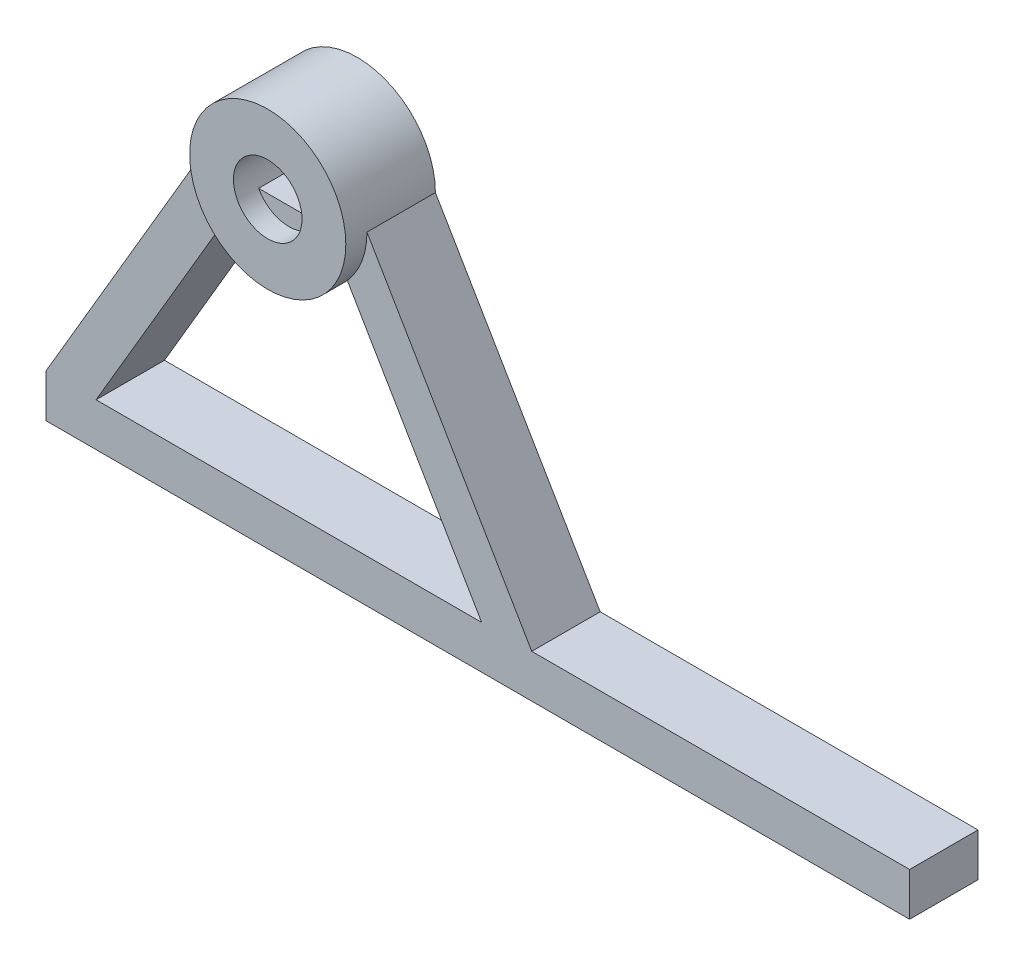
ISO-10303-21;
HEADER;
FILE_DESCRIPTION(('STEP AP214'),'2;1');
FILE_NAME('part.step','',(''),(''),'','','');
FILE_SCHEMA(('AUTOMOTIVE_DESIGN { 1 0 10303 214 1 1 1 1 }'));
ENDSEC;
DATA;
#1=APPLICATION_CONTEXT('core data for automotive mechanical design processes');
#2=APPLICATION_PROTOCOL_DEFINITION('international standard','automotive_design',2000,#1);
#3=PRODUCT_CONTEXT('',#1,'mechanical');
#4=PRODUCT('Part','Part','',(#3));
#5=PRODUCT_RELATED_PRODUCT_CATEGORY('part','',(#4));
#6=PRODUCT_DEFINITION_FORMATION('','',#4);
#7=PRODUCT_DEFINITION_CONTEXT('part definition',#1,'design');
#8=PRODUCT_DEFINITION('design','',#6,#7);
#9=PRODUCT_DEFINITION_SHAPE('','',#8);
#10=(LENGTH_UNIT() NAMED_UNIT(*) SI_UNIT(.MILLI.,.METRE.));
#11=(NAMED_UNIT(*) PLANE_ANGLE_UNIT() SI_UNIT($,.RADIAN.));
#12=(NAMED_UNIT(*) SI_UNIT($,.STERADIAN.) SOLID_ANGLE_UNIT());
#13=UNCERTAINTY_MEASURE_WITH_UNIT(LENGTH_MEASURE(1.E-05),#10,'distance_accuracy_value','');
#14=(GEOMETRIC_REPRESENTATION_CONTEXT(3) GLOBAL_UNCERTAINTY_ASSIGNED_CONTEXT((#13)) GLOBAL_UNIT_ASSIGNED_CONTEXT((#10,
#11,#12)) REPRESENTATION_CONTEXT('',''));
#15=CARTESIAN_POINT('',(0.,0.,0.));
#16=DIRECTION('',(0.,0.,1.));
#17=DIRECTION('',(1.,0.,0.));
#18=AXIS2_PLACEMENT_3D('',#15,#16,#17);
#19=CARTESIAN_POINT('',(0.,0.,6.34));
#20=DIRECTION('',(0.,0.,1.));
#21=DIRECTION('',(1.,0.,0.));
#22=AXIS2_PLACEMENT_3D('',#19,#20,#21);
#23=PLANE('',#22);
#24=DIRECTION('',(1.,0.,0.));
#25=VECTOR('',#24,1.);
#26=CARTESIAN_POINT('',(0.,9.81996617,6.34));
#27=LINE('',#26,#25);
#28=CARTESIAN_POINT('',(-2.79832539218623,9.81996617,6.34));
#29=VERTEX_POINT('',#28);
#30=CARTESIAN_POINT('',(2.79832539216413,9.81996617004123,6.34));
#31=VERTEX_POINT('',#30);
#32=EDGE_CURVE('E262',#29,#31,#27,.T.);
#33=ORIENTED_EDGE('',*,*,#32,.T.);
#34=CARTESIAN_POINT('',(0.,8.31996617,6.34));
#35=DIRECTION('',(0.,0.,1.));
#36=DIRECTION('',(1.,0.,0.));
#37=AXIS2_PLACEMENT_3D('',#34,#35,#36);
#38=CIRCLE('',#37,3.17500000008728);
#39=EDGE_CURVE('E239',#31,#29,#38,.T.);
#40=ORIENTED_EDGE('',*,*,#39,.T.);
#41=EDGE_LOOP('',(#33,#40));
#42=FACE_BOUND('',#41,.T.);
#43=ADVANCED_FACE('F43',(#42),#23,.T.);
#44=DIRECTION('',(1.,0.,0.));
#45=VECTOR('',#44,1.);
#46=CARTESIAN_POINT('',(0.,6.81996617,6.34));
#47=LINE('',#46,#45);
#48=CARTESIAN_POINT('',(-2.79832539218623,6.81996617,6.34));
#49=VERTEX_POINT('',#48);
#50=CARTESIAN_POINT('',(2.79832539216413,6.81996616995877,6.34));
#51=VERTEX_POINT('',#50);
#52=EDGE_CURVE('E152',#49,#51,#47,.T.);
#53=ORIENTED_EDGE('',*,*,#52,.F.);
#54=EDGE_CURVE('E199',#49,#51,#38,.T.);
#55=ORIENTED_EDGE('',*,*,#54,.T.);
#56=EDGE_LOOP('',(#53,#55));
#57=FACE_BOUND('',#56,.T.);
#58=ADVANCED_FACE('F275',(#57),#23,.T.);
#59=CARTESIAN_POINT('',(0.,8.31996617,6.34));
#60=DIRECTION('',(0.,0.,-1.));
#61=DIRECTION('',(-1.,0.,0.));
#62=AXIS2_PLACEMENT_3D('',#59,#60,#61);
#63=CYLINDRICAL_SURFACE('',#62,7.23570529275207);
#64=CARTESIAN_POINT('',(0.,8.31996617,0.));
#65=DIRECTION('',(0.,0.,1.));
#66=DIRECTION('',(1.,0.,0.));
#67=AXIS2_PLACEMENT_3D('',#64,#65,#66);
#68=CIRCLE('',#67,7.23570529275207);
#69=CARTESIAN_POINT('',(-5.41494743750106,3.52061461664813,0.));
#70=VERTEX_POINT('',#69);
#71=CARTESIAN_POINT('',(5.41494743750106,3.52061461664812,0.));
#72=VERTEX_POINT('',#71);
#73=EDGE_CURVE('E186',#70,#72,#68,.T.);
#74=ORIENTED_EDGE('',*,*,#73,.T.);
#75=DIRECTION('',(0.,0.,-1.));
#76=VECTOR('',#75,1.);
#77=CARTESIAN_POINT('',(5.41494743750106,3.52061461664812,6.34));
#78=LINE('',#77,#76);
#79=CARTESIAN_POINT('',(5.41494743750106,3.52061461664812,6.34));
#80=VERTEX_POINT('',#79);
#81=EDGE_CURVE('E145',#80,#72,#78,.T.);
#82=ORIENTED_EDGE('',*,*,#81,.F.);
#83=CARTESIAN_POINT('',(0.,8.31996617,6.34));
#84=DIRECTION('',(0.,0.,1.));
#85=DIRECTION('',(1.,0.,0.));
#86=AXIS2_PLACEMENT_3D('',#83,#84,#85);
#87=CIRCLE('',#86,7.23570529275206);
#88=CARTESIAN_POINT('',(7.23570529275206,8.3199661697027,6.34));
#89=VERTEX_POINT('',#88);
#90=EDGE_CURVE('E53',#80,#89,#87,.T.);
#91=ORIENTED_EDGE('',*,*,#90,.T.);
#92=DIRECTION('',(0.,0.,-1.));
#93=VECTOR('',#92,1.);
#94=CARTESIAN_POINT('',(7.2357052926648,8.31996617,6.34));
#95=LINE('',#94,#93);
#96=CARTESIAN_POINT('',(7.2357052926648,8.31996617,0.));
#97=VERTEX_POINT('',#96);
#98=EDGE_CURVE('E47',#89,#97,#95,.T.);
#99=ORIENTED_EDGE('',*,*,#98,.T.);
#100=CARTESIAN_POINT('',(0.,8.31996617,0.));
#101=DIRECTION('',(0.,0.,1.));
#102=DIRECTION('',(1.,0.,0.));
#103=AXIS2_PLACEMENT_3D('',#100,#101,#102);
#104=CIRCLE('',#103,7.23570529275207);
#105=CARTESIAN_POINT('',(-7.2357052926648,8.31996617,0.));
#106=VERTEX_POINT('',#105);
#107=EDGE_CURVE('E163',#97,#106,#104,.T.);
#108=ORIENTED_EDGE('',*,*,#107,.T.);
#109=DIRECTION('',(0.,0.,-1.));
#110=VECTOR('',#109,1.);
#111=CARTESIAN_POINT('',(-7.2357052926648,8.31996617,6.34));
#112=LINE('',#111,#110);
#113=CARTESIAN_POINT('',(-7.2357052926648,8.31996617,6.34));
#114=VERTEX_POINT('',#113);
#115=EDGE_CURVE('E211',#114,#106,#112,.T.);
#116=ORIENTED_EDGE('',*,*,#115,.F.);
#117=CARTESIAN_POINT('',(-5.41494743750106,3.52061461664813,6.34));
#118=VERTEX_POINT('',#117);
#119=EDGE_CURVE('E11',#114,#118,#87,.T.);
#120=ORIENTED_EDGE('',*,*,#119,.T.);
#121=DIRECTION('',(0.,0.,-1.));
#122=VECTOR('',#121,1.);
#123=CARTESIAN_POINT('',(-5.41494743750106,3.52061461664813,6.34));
#124=LINE('',#123,#122);
#125=EDGE_CURVE('E194',#118,#70,#124,.T.);
#126=ORIENTED_EDGE('',*,*,#125,.T.);
#127=EDGE_LOOP('',(#74,#82,#91,#99,#108,#116,#120,#126));
#128=FACE_BOUND('',#127,.T.);
#129=CARTESIAN_POINT('',(0.,8.31996617,8.3));
#130=DIRECTION('',(0.,0.,1.));
#131=DIRECTION('',(1.,0.,0.));
#132=AXIS2_PLACEMENT_3D('',#129,#130,#131);
#133=CIRCLE('',#132,7.23570529275206);
#134=CARTESIAN_POINT('',(7.23570529275206,8.31996617,8.3));
#135=VERTEX_POINT('',#134);
#136=EDGE_CURVE('E164',#135,#135,#133,.T.);
#137=ORIENTED_EDGE('',*,*,#136,.F.);
#138=EDGE_LOOP('',(#137));
#139=FACE_BOUND('',#138,.T.);
#140=ADVANCED_FACE('F218',(#128,#139),#63,.T.);
#141=CARTESIAN_POINT('',(5.56407471509707,3.26660293174459,6.34));
#142=DIRECTION('',(-0.862366184863107,-0.506285061210232,0.));
#143=DIRECTION('',(0.506285061210233,-0.862366184863108,0.));
#144=AXIS2_PLACEMENT_3D('',#141,#142,#143);
#145=PLANE('',#144);
#146=DIRECTION('',(-0.506285061210233,0.862366184863108,0.));
#147=VECTOR('',#146,1.);
#148=CARTESIAN_POINT('',(5.56407471509707,3.26660293174459,0.));
#149=LINE('',#148,#147);
#150=CARTESIAN_POINT('',(17.8615992020432,-17.68003383,0.));
#151=VERTEX_POINT('',#150);
#152=EDGE_CURVE('E140',#151,#72,#149,.T.);
#153=ORIENTED_EDGE('',*,*,#152,.F.);
#154=DIRECTION('',(0.,0.,-1.));
#155=VECTOR('',#154,1.);
#156=CARTESIAN_POINT('',(17.8615992020432,-17.68003383,6.34));
#157=LINE('',#156,#155);
#158=CARTESIAN_POINT('',(17.8615992020432,-17.68003383,6.34));
#159=VERTEX_POINT('',#158);
#160=EDGE_CURVE('E135',#159,#151,#157,.T.);
#161=ORIENTED_EDGE('',*,*,#160,.F.);
#162=DIRECTION('',(-0.506285061210233,0.862366184863108,0.));
#163=VECTOR('',#162,1.);
#164=CARTESIAN_POINT('',(5.56407471509707,3.26660293174459,6.34));
#165=LINE('',#164,#163);
#166=EDGE_CURVE('E138',#159,#80,#165,.T.);
#167=ORIENTED_EDGE('',*,*,#166,.T.);
#168=ORIENTED_EDGE('',*,*,#81,.T.);
#169=EDGE_LOOP('',(#153,#161,#167,#168));
#170=FACE_BOUND('',#169,.T.);
#171=ADVANCED_FACE('F137',(#170),#145,.T.);
#172=CARTESIAN_POINT('',(0.,-17.68003383,6.34));
#173=DIRECTION('',(0.,1.,0.));
#174=DIRECTION('',(0.,0.,1.));
#175=AXIS2_PLACEMENT_3D('',#172,#173,#174);
#176=PLANE('',#175);
#177=DIRECTION('',(1.,0.,0.));
#178=VECTOR('',#177,1.);
#179=CARTESIAN_POINT('',(0.,-17.68003383,0.));
#180=LINE('',#179,#178);
#181=CARTESIAN_POINT('',(-17.8615992020432,-17.68003383,0.));
#182=VERTEX_POINT('',#181);
#183=EDGE_CURVE('E190',#182,#151,#180,.T.);
#184=ORIENTED_EDGE('',*,*,#183,.F.);
#185=DIRECTION('',(0.,0.,-1.));
#186=VECTOR('',#185,1.);
#187=CARTESIAN_POINT('',(-17.8615992020432,-17.68003383,6.34));
#188=LINE('',#187,#186);
#189=CARTESIAN_POINT('',(-17.8615992020432,-17.68003383,6.34));
#190=VERTEX_POINT('',#189);
#191=EDGE_CURVE('E106',#190,#182,#188,.T.);
#192=ORIENTED_EDGE('',*,*,#191,.F.);
#193=DIRECTION('',(1.,0.,0.));
#194=VECTOR('',#193,1.);
#195=CARTESIAN_POINT('',(0.,-17.68003383,6.34));
#196=LINE('',#195,#194);
#197=EDGE_CURVE('E148',#190,#159,#196,.T.);
#198=ORIENTED_EDGE('',*,*,#197,.T.);
#199=ORIENTED_EDGE('',*,*,#160,.T.);
#200=EDGE_LOOP('',(#184,#192,#198,#199));
#201=FACE_BOUND('',#200,.T.);
#202=ADVANCED_FACE('F154',(#201),#176,.T.);
#203=CARTESIAN_POINT('',(0.,9.81996617,6.34));
#204=DIRECTION('',(0.,1.,0.));
#205=DIRECTION('',(0.,0.,1.));
#206=AXIS2_PLACEMENT_3D('',#203,#204,#205);
#207=PLANE('',#206);
#208=DIRECTION('',(1.,0.,0.));
#209=VECTOR('',#208,1.);
#210=CARTESIAN_POINT('',(0.,9.81996617,0.));
#211=LINE('',#210,#209);
#212=CARTESIAN_POINT('',(-2.79832539216413,9.81996617004123,0.));
#213=VERTEX_POINT('',#212);
#214=CARTESIAN_POINT('',(2.79832539216413,9.81996617004123,0.));
#215=VERTEX_POINT('',#214);
#216=EDGE_CURVE('E176',#213,#215,#211,.T.);
#217=ORIENTED_EDGE('',*,*,#216,.T.);
#218=DIRECTION('',(0.,0.,-1.));
#219=VECTOR('',#218,1.);
#220=CARTESIAN_POINT('',(2.79832539216413,9.81996617004123,6.34));
#221=LINE('',#220,#219);
#222=EDGE_CURVE('E196',#31,#215,#221,.T.);
#223=ORIENTED_EDGE('',*,*,#222,.F.);
#224=ORIENTED_EDGE('',*,*,#32,.F.);
#225=DIRECTION('',(0.,0.,-1.));
#226=VECTOR('',#225,1.);
#227=CARTESIAN_POINT('',(-2.79832539216413,9.81996617004123,6.34));
#228=LINE('',#227,#226);
#229=EDGE_CURVE('E200',#29,#213,#228,.T.);
#230=ORIENTED_EDGE('',*,*,#229,.T.);
#231=EDGE_LOOP('',(#217,#223,#224,#230));
#232=FACE_BOUND('',#231,.T.);
#233=ADVANCED_FACE('F342',(#232),#207,.F.);
#234=CARTESIAN_POINT('',(0.,6.81996617,6.34));
#235=DIRECTION('',(0.,1.,0.));
#236=DIRECTION('',(0.,0.,1.));
#237=AXIS2_PLACEMENT_3D('',#234,#235,#236);
#238=PLANE('',#237);
#239=DIRECTION('',(1.,0.,0.));
#240=VECTOR('',#239,1.);
#241=CARTESIAN_POINT('',(0.,6.81996617,0.));
#242=LINE('',#241,#240);
#243=CARTESIAN_POINT('',(-2.79832539216413,6.81996616995877,0.));
#244=VERTEX_POINT('',#243);
#245=CARTESIAN_POINT('',(2.79832539216413,6.81996616995877,0.));
#246=VERTEX_POINT('',#245);
#247=EDGE_CURVE('E182',#244,#246,#242,.T.);
#248=ORIENTED_EDGE('',*,*,#247,.F.);
#249=DIRECTION('',(0.,0.,-1.));
#250=VECTOR('',#249,1.);
#251=CARTESIAN_POINT('',(-2.79832539216413,6.81996616995877,6.34));
#252=LINE('',#251,#250);
#253=EDGE_CURVE('E202',#49,#244,#252,.T.);
#254=ORIENTED_EDGE('',*,*,#253,.F.);
#255=ORIENTED_EDGE('',*,*,#52,.T.);
#256=DIRECTION('',(0.,0.,-1.));
#257=VECTOR('',#256,1.);
#258=CARTESIAN_POINT('',(2.79832539216413,6.81996616995877,6.34));
#259=LINE('',#258,#257);
#260=EDGE_CURVE('E204',#51,#246,#259,.T.);
#261=ORIENTED_EDGE('',*,*,#260,.T.);
#262=EDGE_LOOP('',(#248,#254,#255,#261));
#263=FACE_BOUND('',#262,.T.);
#264=ADVANCED_FACE('F269',(#263),#238,.T.);
#265=CARTESIAN_POINT('',(9.0135394545495,5.29174317658553,6.34));
#266=DIRECTION('',(-0.862366184863107,-0.506285061210233,0.));
#267=DIRECTION('',(0.506285061210233,-0.862366184863107,0.));
#268=AXIS2_PLACEMENT_3D('',#265,#266,#267);
#269=PLANE('',#268);
#270=DIRECTION('',(-0.506285061210233,0.862366184863107,0.));
#271=VECTOR('',#270,1.);
#272=CARTESIAN_POINT('',(9.0135394545495,5.29174317658553,0.));
#273=LINE('',#272,#271);
#274=CARTESIAN_POINT('',(22.5,-17.68003383,0.));
#275=VERTEX_POINT('',#274);
#276=EDGE_CURVE('E160',#275,#97,#273,.T.);
#277=ORIENTED_EDGE('',*,*,#276,.T.);
#278=ORIENTED_EDGE('',*,*,#98,.F.);
#279=DIRECTION('',(-0.506285061210233,0.862366184863107,0.));
#280=VECTOR('',#279,1.);
#281=CARTESIAN_POINT('',(9.0135394545495,5.29174317658553,6.34));
#282=LINE('',#281,#280);
#283=CARTESIAN_POINT('',(22.5,-17.68003383,6.34));
#284=VERTEX_POINT('',#283);
#285=EDGE_CURVE('E193',#284,#89,#282,.T.);
#286=ORIENTED_EDGE('',*,*,#285,.F.);
#287=DIRECTION('',(0.,0.,-1.));
#288=VECTOR('',#287,1.);
#289=CARTESIAN_POINT('',(22.5,-17.68003383,6.34));
#290=LINE('',#289,#288);
#291=EDGE_CURVE('E156',#284,#275,#290,.T.);
#292=ORIENTED_EDGE('',*,*,#291,.T.);
#293=EDGE_LOOP('',(#277,#278,#286,#292));
#294=FACE_BOUND('',#293,.T.);
#295=ADVANCED_FACE('F45',(#294),#269,.F.);
#296=CARTESIAN_POINT('',(-9.0135394545495,5.29174317658553,6.34));
#297=DIRECTION('',(-0.862366184863107,0.506285061210233,0.));
#298=DIRECTION('',(-0.506285061210233,-0.862366184863108,0.));
#299=AXIS2_PLACEMENT_3D('',#296,#297,#298);
#300=PLANE('',#299);
#301=DIRECTION('',(0.506285061210233,0.862366184863107,0.));
#302=VECTOR('',#301,1.);
#303=CARTESIAN_POINT('',(-9.0135394545495,5.29174317658553,0.));
#304=LINE('',#303,#302);
#305=CARTESIAN_POINT('',(-22.5,-17.68003383,0.));
#306=VERTEX_POINT('',#305);
#307=EDGE_CURVE('E167',#306,#106,#304,.T.);
#308=ORIENTED_EDGE('',*,*,#307,.F.);
#309=DIRECTION('',(0.,0.,-1.));
#310=VECTOR('',#309,1.);
#311=CARTESIAN_POINT('',(-22.5,-17.68003383,6.34));
#312=LINE('',#311,#310);
#313=CARTESIAN_POINT('',(-22.5,-17.68003383,6.34));
#314=VERTEX_POINT('',#313);
#315=EDGE_CURVE('E210',#314,#306,#312,.T.);
#316=ORIENTED_EDGE('',*,*,#315,.F.);
#317=DIRECTION('',(0.506285061210233,0.862366184863107,0.));
#318=VECTOR('',#317,1.);
#319=CARTESIAN_POINT('',(-9.0135394545495,5.29174317658553,6.34));
#320=LINE('',#319,#318);
#321=EDGE_CURVE('E254',#314,#114,#320,.T.);
#322=ORIENTED_EDGE('',*,*,#321,.T.);
#323=ORIENTED_EDGE('',*,*,#115,.T.);
#324=EDGE_LOOP('',(#308,#316,#322,#323));
#325=FACE_BOUND('',#324,.T.);
#326=ADVANCED_FACE('F308',(#325),#300,.T.);
#327=CARTESIAN_POINT('',(-22.5,0.,6.34));
#328=DIRECTION('',(-1.,0.,0.));
#329=DIRECTION('',(0.,-1.,0.));
#330=AXIS2_PLACEMENT_3D('',#327,#328,#329);
#331=PLANE('',#330);
#332=DIRECTION('',(0.,1.,0.));
#333=VECTOR('',#332,1.);
#334=CARTESIAN_POINT('',(-22.5,0.,0.));
#335=LINE('',#334,#333);
#336=CARTESIAN_POINT('',(-22.5,-21.68003383,0.));
#337=VERTEX_POINT('',#336);
#338=EDGE_CURVE('E170',#337,#306,#335,.T.);
#339=ORIENTED_EDGE('',*,*,#338,.F.);
#340=DIRECTION('',(0.,0.,-1.));
#341=VECTOR('',#340,1.);
#342=CARTESIAN_POINT('',(-22.5,-21.68003383,6.34));
#343=LINE('',#342,#341);
#344=CARTESIAN_POINT('',(-22.5,-21.68003383,6.34));
#345=VERTEX_POINT('',#344);
#346=EDGE_CURVE('E208',#345,#337,#343,.T.);
#347=ORIENTED_EDGE('',*,*,#346,.F.);
#348=DIRECTION('',(0.,1.,0.));
#349=VECTOR('',#348,1.);
#350=CARTESIAN_POINT('',(-22.5,0.,6.34));
#351=LINE('',#350,#349);
#352=EDGE_CURVE('E256',#345,#314,#351,.T.);
#353=ORIENTED_EDGE('',*,*,#352,.T.);
#354=ORIENTED_EDGE('',*,*,#315,.T.);
#355=EDGE_LOOP('',(#339,#347,#353,#354));
#356=FACE_BOUND('',#355,.T.);
#357=ADVANCED_FACE('F307',(#356),#331,.T.);
#358=CARTESIAN_POINT('',(0.,-21.68003383,6.34));
#359=DIRECTION('',(0.,1.,0.));
#360=DIRECTION('',(0.,0.,1.));
#361=AXIS2_PLACEMENT_3D('',#358,#359,#360);
#362=PLANE('',#361);
#363=DIRECTION('',(1.,0.,0.));
#364=VECTOR('',#363,1.);
#365=CARTESIAN_POINT('',(0.,-21.68003383,0.));
#366=LINE('',#365,#364);
#367=CARTESIAN_POINT('',(57.5,-21.68003383,0.));
#368=VERTEX_POINT('',#367);
#369=EDGE_CURVE('E173',#337,#368,#366,.T.);
#370=ORIENTED_EDGE('',*,*,#369,.T.);
#371=DIRECTION('',(0.,0.,-1.));
#372=VECTOR('',#371,1.);
#373=CARTESIAN_POINT('',(57.5,-21.68003383,6.34));
#374=LINE('',#373,#372);
#375=CARTESIAN_POINT('',(57.5,-21.68003383,6.34));
#376=VERTEX_POINT('',#375);
#377=EDGE_CURVE('E295',#376,#368,#374,.T.);
#378=ORIENTED_EDGE('',*,*,#377,.F.);
#379=DIRECTION('',(1.,0.,0.));
#380=VECTOR('',#379,1.);
#381=CARTESIAN_POINT('',(0.,-21.68003383,6.34));
#382=LINE('',#381,#380);
#383=EDGE_CURVE('E259',#345,#376,#382,.T.);
#384=ORIENTED_EDGE('',*,*,#383,.F.);
#385=ORIENTED_EDGE('',*,*,#346,.T.);
#386=EDGE_LOOP('',(#370,#378,#384,#385));
#387=FACE_BOUND('',#386,.T.);
#388=ADVANCED_FACE('F292',(#387),#362,.F.);
#389=CARTESIAN_POINT('',(0.,8.31996617,6.34));
#390=DIRECTION('',(0.,0.,-1.));
#391=DIRECTION('',(-1.,0.,0.));
#392=AXIS2_PLACEMENT_3D('',#389,#390,#391);
#393=CYLINDRICAL_SURFACE('',#392,3.17500000017456);
#394=CARTESIAN_POINT('',(0.,8.31996617,0.));
#395=DIRECTION('',(0.,0.,1.));
#396=DIRECTION('',(1.,0.,0.));
#397=AXIS2_PLACEMENT_3D('',#394,#395,#396);
#398=CIRCLE('',#397,3.17500000017456);
#399=EDGE_CURVE('E183',#213,#244,#398,.T.);
#400=ORIENTED_EDGE('',*,*,#399,.F.);
#401=ORIENTED_EDGE('',*,*,#229,.F.);
#402=ORIENTED_EDGE('',*,*,#39,.F.);
#403=ORIENTED_EDGE('',*,*,#222,.T.);
#404=EDGE_CURVE('E179',#246,#215,#398,.T.);
#405=ORIENTED_EDGE('',*,*,#404,.F.);
#406=ORIENTED_EDGE('',*,*,#260,.F.);
#407=ORIENTED_EDGE('',*,*,#54,.F.);
#408=ORIENTED_EDGE('',*,*,#253,.T.);
#409=EDGE_LOOP('',(#400,#401,#402,#403,#405,#406,#407,#408));
#410=FACE_BOUND('',#409,.T.);
#411=CARTESIAN_POINT('',(0.,8.31996617,8.3));
#412=DIRECTION('',(0.,0.,1.));
#413=DIRECTION('',(1.,0.,0.));
#414=AXIS2_PLACEMENT_3D('',#411,#412,#413);
#415=CIRCLE('',#414,3.17500000008728);
#416=CARTESIAN_POINT('',(3.17500000008728,8.31996617,8.3));
#417=VERTEX_POINT('',#416);
#418=EDGE_CURVE('E243',#417,#417,#415,.T.);
#419=ORIENTED_EDGE('',*,*,#418,.T.);
#420=EDGE_LOOP('',(#419));
#421=FACE_BOUND('',#420,.T.);
#422=ADVANCED_FACE('F333',(#410,#421),#393,.F.);
#423=CARTESIAN_POINT('',(-5.56407471509708,3.2666029317446,6.34));
#424=DIRECTION('',(-0.862366184863107,0.506285061210232,0.));
#425=DIRECTION('',(-0.506285061210232,-0.862366184863107,0.));
#426=AXIS2_PLACEMENT_3D('',#423,#424,#425);
#427=PLANE('',#426);
#428=DIRECTION('',(0.506285061210232,0.862366184863107,0.));
#429=VECTOR('',#428,1.);
#430=CARTESIAN_POINT('',(-5.56407471509708,3.2666029317446,0.));
#431=LINE('',#430,#429);
#432=EDGE_CURVE('E109',#182,#70,#431,.T.);
#433=ORIENTED_EDGE('',*,*,#432,.T.);
#434=ORIENTED_EDGE('',*,*,#125,.F.);
#435=DIRECTION('',(0.506285061210232,0.862366184863107,0.));
#436=VECTOR('',#435,1.);
#437=CARTESIAN_POINT('',(-5.56407471509708,3.2666029317446,6.34));
#438=LINE('',#437,#436);
#439=EDGE_CURVE('E62',#190,#118,#438,.T.);
#440=ORIENTED_EDGE('',*,*,#439,.F.);
#441=ORIENTED_EDGE('',*,*,#191,.T.);
#442=EDGE_LOOP('',(#433,#434,#440,#441));
#443=FACE_BOUND('',#442,.T.);
#444=ADVANCED_FACE('F326',(#443),#427,.F.);
#445=ORIENTED_EDGE('',*,*,#119,.F.);
#446=ORIENTED_EDGE('',*,*,#321,.F.);
#447=ORIENTED_EDGE('',*,*,#352,.F.);
#448=ORIENTED_EDGE('',*,*,#383,.T.);
#449=DIRECTION('',(0.,-1.,0.));
#450=VECTOR('',#449,1.);
#451=CARTESIAN_POINT('',(57.5,-17.68003383,6.34));
#452=LINE('',#451,#450);
#453=CARTESIAN_POINT('',(57.5,-17.68003383,6.34));
#454=VERTEX_POINT('',#453);
#455=EDGE_CURVE('E245',#454,#376,#452,.T.);
#456=ORIENTED_EDGE('',*,*,#455,.F.);
#457=DIRECTION('',(-1.,0.,0.));
#458=VECTOR('',#457,1.);
#459=CARTESIAN_POINT('',(57.5,-17.68003383,6.34));
#460=LINE('',#459,#458);
#461=EDGE_CURVE('E240',#454,#284,#460,.T.);
#462=ORIENTED_EDGE('',*,*,#461,.T.);
#463=ORIENTED_EDGE('',*,*,#285,.T.);
#464=ORIENTED_EDGE('',*,*,#90,.F.);
#465=ORIENTED_EDGE('',*,*,#166,.F.);
#466=ORIENTED_EDGE('',*,*,#197,.F.);
#467=ORIENTED_EDGE('',*,*,#439,.T.);
#468=EDGE_LOOP('',(#445,#446,#447,#448,#456,#462,#463,#464,#465,#466,#467));
#469=FACE_BOUND('',#468,.T.);
#470=ADVANCED_FACE('F147',(#469),#23,.T.);
#471=CARTESIAN_POINT('',(0.,0.,0.));
#472=DIRECTION('',(0.,0.,1.));
#473=DIRECTION('',(1.,0.,0.));
#474=AXIS2_PLACEMENT_3D('',#471,#472,#473);
#475=PLANE('',#474);
#476=ORIENTED_EDGE('',*,*,#276,.F.);
#477=DIRECTION('',(-1.,0.,0.));
#478=VECTOR('',#477,1.);
#479=CARTESIAN_POINT('',(57.5,-17.68003383,0.));
#480=LINE('',#479,#478);
#481=CARTESIAN_POINT('',(57.5,-17.68003383,0.));
#482=VERTEX_POINT('',#481);
#483=EDGE_CURVE('E231',#482,#275,#480,.T.);
#484=ORIENTED_EDGE('',*,*,#483,.F.);
#485=DIRECTION('',(0.,1.,0.));
#486=VECTOR('',#485,1.);
#487=CARTESIAN_POINT('',(57.5,-21.68003383,0.));
#488=LINE('',#487,#486);
#489=EDGE_CURVE('E297',#368,#482,#488,.T.);
#490=ORIENTED_EDGE('',*,*,#489,.F.);
#491=ORIENTED_EDGE('',*,*,#369,.F.);
#492=ORIENTED_EDGE('',*,*,#338,.T.);
#493=ORIENTED_EDGE('',*,*,#307,.T.);
#494=ORIENTED_EDGE('',*,*,#107,.F.);
#495=EDGE_LOOP('',(#476,#484,#490,#491,#492,#493,#494));
#496=FACE_BOUND('',#495,.T.);
#497=ORIENTED_EDGE('',*,*,#216,.F.);
#498=ORIENTED_EDGE('',*,*,#399,.T.);
#499=ORIENTED_EDGE('',*,*,#247,.T.);
#500=ORIENTED_EDGE('',*,*,#404,.T.);
#501=EDGE_LOOP('',(#497,#498,#499,#500));
#502=FACE_BOUND('',#501,.T.);
#503=ORIENTED_EDGE('',*,*,#73,.F.);
#504=ORIENTED_EDGE('',*,*,#432,.F.);
#505=ORIENTED_EDGE('',*,*,#183,.T.);
#506=ORIENTED_EDGE('',*,*,#152,.T.);
#507=EDGE_LOOP('',(#503,#504,#505,#506));
#508=FACE_BOUND('',#507,.T.);
#509=ADVANCED_FACE('F227',(#496,#502,#508),#475,.F.);
#510=CARTESIAN_POINT('',(0.,8.31996617,8.3));
#511=DIRECTION('',(0.,0.,1.));
#512=DIRECTION('',(1.,0.,0.));
#513=AXIS2_PLACEMENT_3D('',#510,#511,#512);
#514=PLANE('',#513);
#515=ORIENTED_EDGE('',*,*,#136,.T.);
#516=EDGE_LOOP('',(#515));
#517=FACE_BOUND('',#516,.T.);
#518=ORIENTED_EDGE('',*,*,#418,.F.);
#519=EDGE_LOOP('',(#518));
#520=FACE_BOUND('',#519,.T.);
#521=ADVANCED_FACE('F331',(#517,#520),#514,.T.);
#522=CARTESIAN_POINT('',(57.5,-17.68003383,0.));
#523=DIRECTION('',(0.,-1.,0.));
#524=DIRECTION('',(1.,0.,0.));
#525=AXIS2_PLACEMENT_3D('',#522,#523,#524);
#526=PLANE('',#525);
#527=ORIENTED_EDGE('',*,*,#291,.F.);
#528=ORIENTED_EDGE('',*,*,#461,.F.);
#529=DIRECTION('',(0.,0.,1.));
#530=VECTOR('',#529,1.);
#531=CARTESIAN_POINT('',(57.5,-17.68003383,0.));
#532=LINE('',#531,#530);
#533=EDGE_CURVE('E238',#482,#454,#532,.T.);
#534=ORIENTED_EDGE('',*,*,#533,.F.);
#535=ORIENTED_EDGE('',*,*,#483,.T.);
#536=EDGE_LOOP('',(#527,#528,#534,#535));
#537=FACE_BOUND('',#536,.T.);
#538=ADVANCED_FACE('F234',(#537),#526,.F.);
#539=CARTESIAN_POINT('',(57.5,0.,0.));
#540=DIRECTION('',(1.,0.,0.));
#541=DIRECTION('',(0.,1.,0.));
#542=AXIS2_PLACEMENT_3D('',#539,#540,#541);
#543=PLANE('',#542);
#544=ORIENTED_EDGE('',*,*,#377,.T.);
#545=ORIENTED_EDGE('',*,*,#489,.T.);
#546=ORIENTED_EDGE('',*,*,#533,.T.);
#547=ORIENTED_EDGE('',*,*,#455,.T.);
#548=EDGE_LOOP('',(#544,#545,#546,#547));
#549=FACE_BOUND('',#548,.T.);
#550=ADVANCED_FACE('F301',(#549),#543,.T.);
#551=CLOSED_SHELL('',(#43,#58,#140,#171,#202,#233,#264,#295,#326,#357,#388,#422,#444,#470,#509,
#521,#538,#550));
#552=MANIFOLD_SOLID_BREP('B2',#551);
#553=ADVANCED_BREP_SHAPE_REPRESENTATION('',(#18,#552),#14);
#554=SHAPE_DEFINITION_REPRESENTATION(#9,#553);
ENDSEC;
END-ISO-10303-21;
